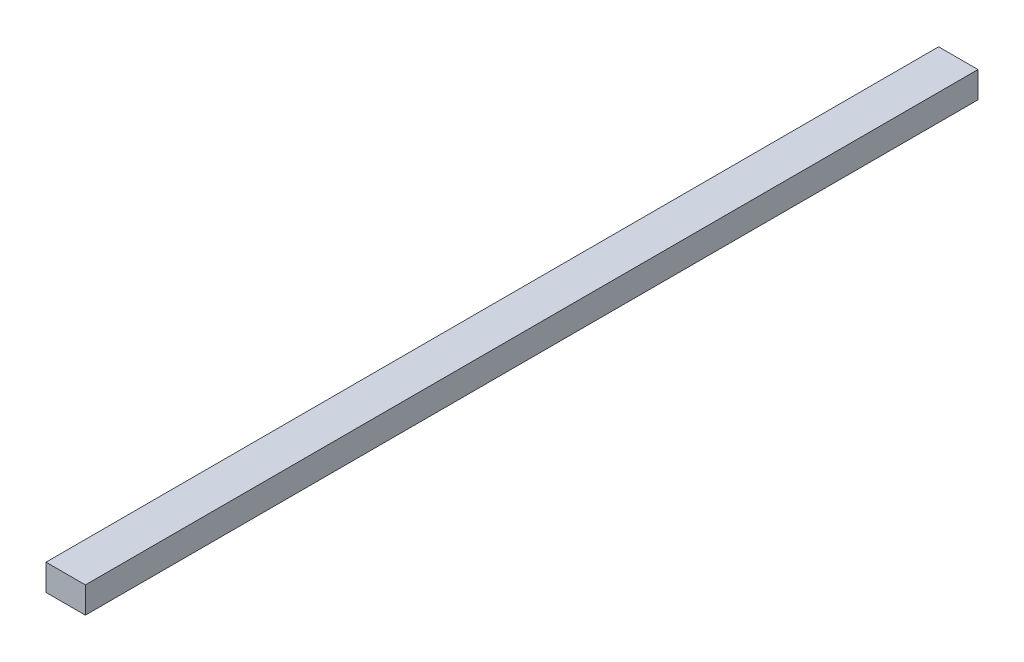
ISO-10303-21;
HEADER;
FILE_DESCRIPTION(('STEP AP214'),'2;1');
FILE_NAME('part.step','',(''),(''),'','','');
FILE_SCHEMA(('AUTOMOTIVE_DESIGN { 1 0 10303 214 1 1 1 1 }'));
ENDSEC;
DATA;
#1=APPLICATION_CONTEXT('core data for automotive mechanical design processes');
#2=APPLICATION_PROTOCOL_DEFINITION('international standard','automotive_design',2000,#1);
#3=PRODUCT_CONTEXT('',#1,'mechanical');
#4=PRODUCT('Part','Part','',(#3));
#5=PRODUCT_RELATED_PRODUCT_CATEGORY('part','',(#4));
#6=PRODUCT_DEFINITION_FORMATION('','',#4);
#7=PRODUCT_DEFINITION_CONTEXT('part definition',#1,'design');
#8=PRODUCT_DEFINITION('design','',#6,#7);
#9=PRODUCT_DEFINITION_SHAPE('','',#8);
#10=(LENGTH_UNIT() NAMED_UNIT(*) SI_UNIT(.MILLI.,.METRE.));
#11=(NAMED_UNIT(*) PLANE_ANGLE_UNIT() SI_UNIT($,.RADIAN.));
#12=(NAMED_UNIT(*) SI_UNIT($,.STERADIAN.) SOLID_ANGLE_UNIT());
#13=UNCERTAINTY_MEASURE_WITH_UNIT(LENGTH_MEASURE(1.E-05),#10,'distance_accuracy_value','');
#14=(GEOMETRIC_REPRESENTATION_CONTEXT(3) GLOBAL_UNCERTAINTY_ASSIGNED_CONTEXT((#13)) GLOBAL_UNIT_ASSIGNED_CONTEXT((#10,
#11,#12)) REPRESENTATION_CONTEXT('',''));
#15=CARTESIAN_POINT('',(0.,0.,0.));
#16=DIRECTION('',(0.,0.,1.));
#17=DIRECTION('',(1.,0.,0.));
#18=AXIS2_PLACEMENT_3D('',#15,#16,#17);
#19=CARTESIAN_POINT('',(35.,0.,-700.));
#20=DIRECTION('',(-1.,0.,0.));
#21=DIRECTION('',(0.,0.,1.));
#22=AXIS2_PLACEMENT_3D('',#19,#20,#21);
#23=PLANE('',#22);
#24=DIRECTION('',(0.,-1.,0.));
#25=VECTOR('',#24,1.);
#26=CARTESIAN_POINT('',(35.,0.,-20.));
#27=LINE('',#26,#25);
#28=CARTESIAN_POINT('',(35.,20.,-20.));
#29=VERTEX_POINT('',#28);
#30=CARTESIAN_POINT('',(35.,0.,-20.));
#31=VERTEX_POINT('',#30);
#32=EDGE_CURVE('E103',#29,#31,#27,.T.);
#33=ORIENTED_EDGE('',*,*,#32,.F.);
#34=DIRECTION('',(0.,0.,1.));
#35=VECTOR('',#34,1.);
#36=CARTESIAN_POINT('',(35.,20.,-700.));
#37=LINE('',#36,#35);
#38=CARTESIAN_POINT('',(35.,20.,-700.));
#39=VERTEX_POINT('',#38);
#40=EDGE_CURVE('E11',#39,#29,#37,.T.);
#41=ORIENTED_EDGE('',*,*,#40,.F.);
#42=DIRECTION('',(0.,-1.,0.));
#43=VECTOR('',#42,1.);
#44=CARTESIAN_POINT('',(35.,0.,-700.));
#45=LINE('',#44,#43);
#46=CARTESIAN_POINT('',(35.,0.,-700.));
#47=VERTEX_POINT('',#46);
#48=EDGE_CURVE('E97',#39,#47,#45,.T.);
#49=ORIENTED_EDGE('',*,*,#48,.T.);
#50=DIRECTION('',(0.,0.,1.));
#51=VECTOR('',#50,1.);
#52=CARTESIAN_POINT('',(35.,0.,-700.));
#53=LINE('',#52,#51);
#54=EDGE_CURVE('E42',#47,#31,#53,.T.);
#55=ORIENTED_EDGE('',*,*,#54,.T.);
#56=EDGE_LOOP('',(#33,#41,#49,#55));
#57=FACE_BOUND('',#56,.T.);
#58=ADVANCED_FACE('F39',(#57),#23,.T.);
#59=CARTESIAN_POINT('',(35.,20.,-700.));
#60=DIRECTION('',(0.,1.,0.));
#61=DIRECTION('',(0.,0.,1.));
#62=AXIS2_PLACEMENT_3D('',#59,#60,#61);
#63=PLANE('',#62);
#64=DIRECTION('',(-1.,0.,0.));
#65=VECTOR('',#64,1.);
#66=CARTESIAN_POINT('',(35.,20.,-20.));
#67=LINE('',#66,#65);
#68=CARTESIAN_POINT('',(65.,20.,-20.));
#69=VERTEX_POINT('',#68);
#70=EDGE_CURVE('E99',#69,#29,#67,.T.);
#71=ORIENTED_EDGE('',*,*,#70,.F.);
#72=DIRECTION('',(0.,0.,1.));
#73=VECTOR('',#72,1.);
#74=CARTESIAN_POINT('',(65.,20.,-700.));
#75=LINE('',#74,#73);
#76=CARTESIAN_POINT('',(65.,20.,-700.));
#77=VERTEX_POINT('',#76);
#78=EDGE_CURVE('E48',#77,#69,#75,.T.);
#79=ORIENTED_EDGE('',*,*,#78,.F.);
#80=DIRECTION('',(-1.,0.,0.));
#81=VECTOR('',#80,1.);
#82=CARTESIAN_POINT('',(35.,20.,-700.));
#83=LINE('',#82,#81);
#84=EDGE_CURVE('E94',#77,#39,#83,.T.);
#85=ORIENTED_EDGE('',*,*,#84,.T.);
#86=ORIENTED_EDGE('',*,*,#40,.T.);
#87=EDGE_LOOP('',(#71,#79,#85,#86));
#88=FACE_BOUND('',#87,.T.);
#89=ADVANCED_FACE('F113',(#88),#63,.T.);
#90=CARTESIAN_POINT('',(65.,0.,-700.));
#91=DIRECTION('',(1.,0.,0.));
#92=DIRECTION('',(0.,0.,-1.));
#93=AXIS2_PLACEMENT_3D('',#90,#91,#92);
#94=PLANE('',#93);
#95=DIRECTION('',(0.,1.,0.));
#96=VECTOR('',#95,1.);
#97=CARTESIAN_POINT('',(65.,0.,-20.));
#98=LINE('',#97,#96);
#99=CARTESIAN_POINT('',(65.,0.,-20.));
#100=VERTEX_POINT('',#99);
#101=EDGE_CURVE('E89',#100,#69,#98,.T.);
#102=ORIENTED_EDGE('',*,*,#101,.F.);
#103=DIRECTION('',(0.,0.,1.));
#104=VECTOR('',#103,1.);
#105=CARTESIAN_POINT('',(65.,0.,-700.));
#106=LINE('',#105,#104);
#107=CARTESIAN_POINT('',(65.,0.,-700.));
#108=VERTEX_POINT('',#107);
#109=EDGE_CURVE('E84',#108,#100,#106,.T.);
#110=ORIENTED_EDGE('',*,*,#109,.F.);
#111=DIRECTION('',(0.,1.,0.));
#112=VECTOR('',#111,1.);
#113=CARTESIAN_POINT('',(65.,0.,-700.));
#114=LINE('',#113,#112);
#115=EDGE_CURVE('E87',#108,#77,#114,.T.);
#116=ORIENTED_EDGE('',*,*,#115,.T.);
#117=ORIENTED_EDGE('',*,*,#78,.T.);
#118=EDGE_LOOP('',(#102,#110,#116,#117));
#119=FACE_BOUND('',#118,.T.);
#120=ADVANCED_FACE('F86',(#119),#94,.T.);
#121=CARTESIAN_POINT('',(35.,0.,-700.));
#122=DIRECTION('',(0.,-1.,0.));
#123=DIRECTION('',(0.,0.,-1.));
#124=AXIS2_PLACEMENT_3D('',#121,#122,#123);
#125=PLANE('',#124);
#126=DIRECTION('',(1.,0.,0.));
#127=VECTOR('',#126,1.);
#128=CARTESIAN_POINT('',(35.,0.,-20.));
#129=LINE('',#128,#127);
#130=EDGE_CURVE('E106',#31,#100,#129,.T.);
#131=ORIENTED_EDGE('',*,*,#130,.F.);
#132=ORIENTED_EDGE('',*,*,#54,.F.);
#133=DIRECTION('',(1.,0.,0.));
#134=VECTOR('',#133,1.);
#135=CARTESIAN_POINT('',(35.,0.,-700.));
#136=LINE('',#135,#134);
#137=EDGE_CURVE('E93',#47,#108,#136,.T.);
#138=ORIENTED_EDGE('',*,*,#137,.T.);
#139=ORIENTED_EDGE('',*,*,#109,.T.);
#140=EDGE_LOOP('',(#131,#132,#138,#139));
#141=FACE_BOUND('',#140,.T.);
#142=ADVANCED_FACE('F96',(#141),#125,.T.);
#143=CARTESIAN_POINT('',(0.,0.,-700.));
#144=DIRECTION('',(0.,0.,-1.));
#145=DIRECTION('',(-1.,0.,0.));
#146=AXIS2_PLACEMENT_3D('',#143,#144,#145);
#147=PLANE('',#146);
#148=ORIENTED_EDGE('',*,*,#48,.F.);
#149=ORIENTED_EDGE('',*,*,#84,.F.);
#150=ORIENTED_EDGE('',*,*,#115,.F.);
#151=ORIENTED_EDGE('',*,*,#137,.F.);
#152=EDGE_LOOP('',(#148,#149,#150,#151));
#153=FACE_BOUND('',#152,.T.);
#154=ADVANCED_FACE('F92',(#153),#147,.T.);
#155=CARTESIAN_POINT('',(0.,0.,-20.));
#156=DIRECTION('',(0.,0.,-1.));
#157=DIRECTION('',(-1.,0.,0.));
#158=AXIS2_PLACEMENT_3D('',#155,#156,#157);
#159=PLANE('',#158);
#160=ORIENTED_EDGE('',*,*,#32,.T.);
#161=ORIENTED_EDGE('',*,*,#130,.T.);
#162=ORIENTED_EDGE('',*,*,#101,.T.);
#163=ORIENTED_EDGE('',*,*,#70,.T.);
#164=EDGE_LOOP('',(#160,#161,#162,#163));
#165=FACE_BOUND('',#164,.T.);
#166=ADVANCED_FACE('F112',(#165),#159,.F.);
#167=CLOSED_SHELL('',(#58,#89,#120,#142,#154,#166));
#168=MANIFOLD_SOLID_BREP('B2',#167);
#169=ADVANCED_BREP_SHAPE_REPRESENTATION('',(#18,#168),#14);
#170=SHAPE_DEFINITION_REPRESENTATION(#9,#169);
ENDSEC;
END-ISO-10303-21;
